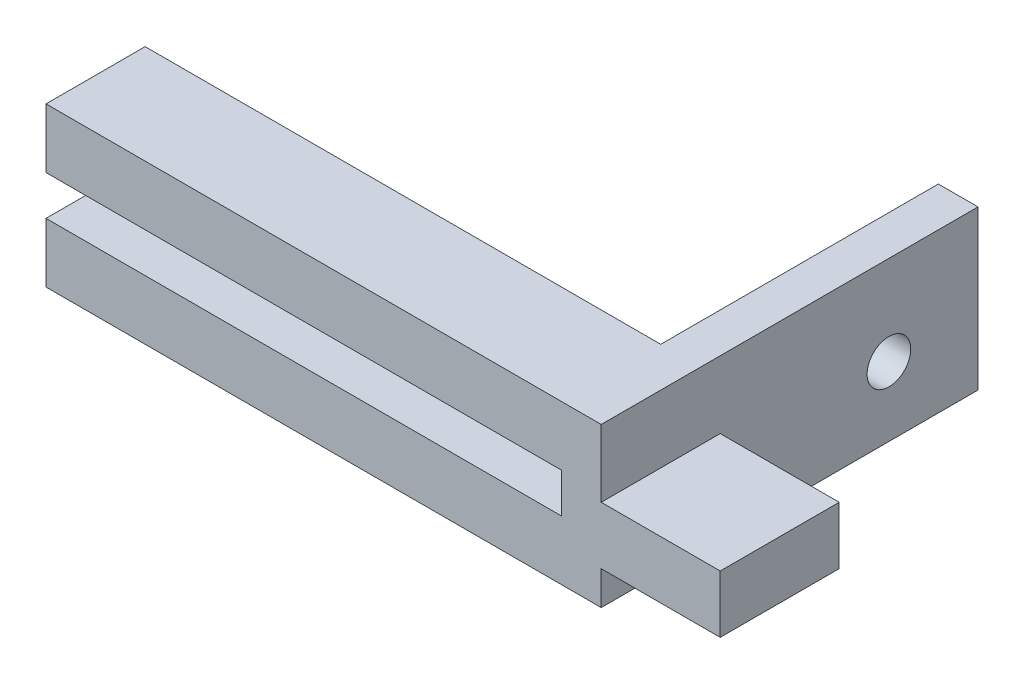
ISO-10303-21;
HEADER;
FILE_DESCRIPTION(('STEP AP214'),'2;1');
FILE_NAME('part.step','',(''),(''),'','','');
FILE_SCHEMA(('AUTOMOTIVE_DESIGN { 1 0 10303 214 1 1 1 1 }'));
ENDSEC;
DATA;
#1=APPLICATION_CONTEXT('core data for automotive mechanical design processes');
#2=APPLICATION_PROTOCOL_DEFINITION('international standard','automotive_design',2000,#1);
#3=PRODUCT_CONTEXT('',#1,'mechanical');
#4=PRODUCT('Part','Part','',(#3));
#5=PRODUCT_RELATED_PRODUCT_CATEGORY('part','',(#4));
#6=PRODUCT_DEFINITION_FORMATION('','',#4);
#7=PRODUCT_DEFINITION_CONTEXT('part definition',#1,'design');
#8=PRODUCT_DEFINITION('design','',#6,#7);
#9=PRODUCT_DEFINITION_SHAPE('','',#8);
#10=(LENGTH_UNIT() NAMED_UNIT(*) SI_UNIT(.MILLI.,.METRE.));
#11=(NAMED_UNIT(*) PLANE_ANGLE_UNIT() SI_UNIT($,.RADIAN.));
#12=(NAMED_UNIT(*) SI_UNIT($,.STERADIAN.) SOLID_ANGLE_UNIT());
#13=UNCERTAINTY_MEASURE_WITH_UNIT(LENGTH_MEASURE(1.E-05),#10,'distance_accuracy_value','');
#14=(GEOMETRIC_REPRESENTATION_CONTEXT(3) GLOBAL_UNCERTAINTY_ASSIGNED_CONTEXT((#13)) GLOBAL_UNIT_ASSIGNED_CONTEXT((#10,
#11,#12)) REPRESENTATION_CONTEXT('',''));
#15=CARTESIAN_POINT('',(0.,0.,0.));
#16=DIRECTION('',(0.,0.,1.));
#17=DIRECTION('',(1.,0.,0.));
#18=AXIS2_PLACEMENT_3D('',#15,#16,#17);
#19=CARTESIAN_POINT('',(10.,0.,0.));
#20=DIRECTION('',(1.,0.,0.));
#21=DIRECTION('',(0.,0.,-1.));
#22=AXIS2_PLACEMENT_3D('',#19,#20,#21);
#23=PLANE('',#22);
#24=CARTESIAN_POINT('',(10.,-2.43042682926831,-36.6253658536586));
#25=DIRECTION('',(1.,0.,0.));
#26=DIRECTION('',(0.,0.,-1.));
#27=AXIS2_PLACEMENT_3D('',#24,#25,#26);
#28=CIRCLE('',#27,5.5);
#29=CARTESIAN_POINT('',(10.,-2.43042682926831,-42.1253658536586));
#30=VERTEX_POINT('',#29);
#31=EDGE_CURVE('E49',#30,#30,#28,.T.);
#32=ORIENTED_EDGE('',*,*,#31,.F.);
#33=EDGE_LOOP('',(#32));
#34=FACE_BOUND('',#33,.T.);
#35=DIRECTION('',(0.,1.,0.));
#36=VECTOR('',#35,1.);
#37=CARTESIAN_POINT('',(10.,-2.8704268292683,5.91463414634144));
#38=LINE('',#37,#36);
#39=CARTESIAN_POINT('',(10.,-11.3704268292683,5.91463414634144));
#40=VERTEX_POINT('',#39);
#41=CARTESIAN_POINT('',(10.,3.1295731707317,5.91463414634144));
#42=VERTEX_POINT('',#41);
#43=EDGE_CURVE('E178',#40,#42,#38,.T.);
#44=ORIENTED_EDGE('',*,*,#43,.F.);
#45=DIRECTION('',(0.,0.,-1.));
#46=VECTOR('',#45,1.);
#47=CARTESIAN_POINT('',(10.,-11.3704268292683,35.9146341463414));
#48=LINE('',#47,#46);
#49=CARTESIAN_POINT('',(10.,-11.3704268292683,35.9146341463414));
#50=VERTEX_POINT('',#49);
#51=EDGE_CURVE('E166',#50,#40,#48,.T.);
#52=ORIENTED_EDGE('',*,*,#51,.F.);
#53=DIRECTION('',(0.,-1.,0.));
#54=VECTOR('',#53,1.);
#55=CARTESIAN_POINT('',(10.,20.1295731707317,35.9146341463414));
#56=LINE('',#55,#54);
#57=CARTESIAN_POINT('',(10.,-19.8704268292683,35.9146341463414));
#58=VERTEX_POINT('',#57);
#59=EDGE_CURVE('E161',#50,#58,#56,.T.);
#60=ORIENTED_EDGE('',*,*,#59,.T.);
#61=DIRECTION('',(0.,0.,-1.));
#62=VECTOR('',#61,1.);
#63=CARTESIAN_POINT('',(10.,-19.8704268292683,35.9146341463414));
#64=LINE('',#63,#62);
#65=CARTESIAN_POINT('',(10.,-19.8704268292683,-59.0853658536586));
#66=VERTEX_POINT('',#65);
#67=EDGE_CURVE('E270',#58,#66,#64,.T.);
#68=ORIENTED_EDGE('',*,*,#67,.T.);
#69=DIRECTION('',(0.,1.,0.));
#70=VECTOR('',#69,1.);
#71=CARTESIAN_POINT('',(10.,20.1295731707317,-59.0853658536586));
#72=LINE('',#71,#70);
#73=CARTESIAN_POINT('',(10.,20.1295731707317,-59.0853658536586));
#74=VERTEX_POINT('',#73);
#75=EDGE_CURVE('E273',#66,#74,#72,.T.);
#76=ORIENTED_EDGE('',*,*,#75,.T.);
#77=DIRECTION('',(0.,0.,1.));
#78=VECTOR('',#77,1.);
#79=CARTESIAN_POINT('',(10.,20.1295731707317,35.9146341463414));
#80=LINE('',#79,#78);
#81=CARTESIAN_POINT('',(10.,20.1295731707317,35.9146341463414));
#82=VERTEX_POINT('',#81);
#83=EDGE_CURVE('E276',#74,#82,#80,.T.);
#84=ORIENTED_EDGE('',*,*,#83,.T.);
#85=CARTESIAN_POINT('',(10.,3.12957317073169,35.9146341463414));
#86=VERTEX_POINT('',#85);
#87=EDGE_CURVE('E67',#82,#86,#56,.T.);
#88=ORIENTED_EDGE('',*,*,#87,.T.);
#89=DIRECTION('',(0.,0.,1.));
#90=VECTOR('',#89,1.);
#91=CARTESIAN_POINT('',(10.,3.1295731707317,5.91463414634144));
#92=LINE('',#91,#90);
#93=EDGE_CURVE('E62',#42,#86,#92,.T.);
#94=ORIENTED_EDGE('',*,*,#93,.F.);
#95=EDGE_LOOP('',(#44,#52,#60,#68,#76,#84,#88,#94));
#96=FACE_BOUND('',#95,.T.);
#97=ADVANCED_FACE('F45',(#34,#96),#23,.T.);
#98=CARTESIAN_POINT('',(0.,0.,0.));
#99=DIRECTION('',(1.,0.,0.));
#100=DIRECTION('',(0.,0.,-1.));
#101=AXIS2_PLACEMENT_3D('',#98,#99,#100);
#102=PLANE('',#101);
#103=CARTESIAN_POINT('',(0.,-2.43042682926831,-36.6253658536586));
#104=DIRECTION('',(-1.,0.,0.));
#105=DIRECTION('',(0.,0.,1.));
#106=AXIS2_PLACEMENT_3D('',#103,#104,#105);
#107=CIRCLE('',#106,5.5);
#108=CARTESIAN_POINT('',(0.,-2.43042682926831,-31.1253658536586));
#109=VERTEX_POINT('',#108);
#110=EDGE_CURVE('E195',#109,#109,#107,.T.);
#111=ORIENTED_EDGE('',*,*,#110,.F.);
#112=EDGE_LOOP('',(#111));
#113=FACE_BOUND('',#112,.T.);
#114=DIRECTION('',(0.,-1.,0.));
#115=VECTOR('',#114,1.);
#116=CARTESIAN_POINT('',(0.,20.1295731707317,10.9146341463414));
#117=LINE('',#116,#115);
#118=CARTESIAN_POINT('',(0.,20.1295731707317,10.9146341463414));
#119=VERTEX_POINT('',#118);
#120=CARTESIAN_POINT('',(0.,5.12957317073169,10.9146341463414));
#121=VERTEX_POINT('',#120);
#122=EDGE_CURVE('E215',#119,#121,#117,.T.);
#123=ORIENTED_EDGE('',*,*,#122,.F.);
#124=DIRECTION('',(0.,0.,1.));
#125=VECTOR('',#124,1.);
#126=CARTESIAN_POINT('',(0.,20.1295731707317,35.9146341463414));
#127=LINE('',#126,#125);
#128=CARTESIAN_POINT('',(0.,20.1295731707317,-59.0853658536586));
#129=VERTEX_POINT('',#128);
#130=EDGE_CURVE('E289',#129,#119,#127,.T.);
#131=ORIENTED_EDGE('',*,*,#130,.F.);
#132=DIRECTION('',(0.,1.,0.));
#133=VECTOR('',#132,1.);
#134=CARTESIAN_POINT('',(0.,20.1295731707317,-59.0853658536586));
#135=LINE('',#134,#133);
#136=CARTESIAN_POINT('',(0.,-19.8704268292683,-59.0853658536586));
#137=VERTEX_POINT('',#136);
#138=EDGE_CURVE('E286',#137,#129,#135,.T.);
#139=ORIENTED_EDGE('',*,*,#138,.F.);
#140=DIRECTION('',(0.,0.,-1.));
#141=VECTOR('',#140,1.);
#142=CARTESIAN_POINT('',(0.,-19.8704268292683,35.9146341463414));
#143=LINE('',#142,#141);
#144=CARTESIAN_POINT('',(0.,-19.8704268292683,10.9146341463414));
#145=VERTEX_POINT('',#144);
#146=EDGE_CURVE('E283',#145,#137,#143,.T.);
#147=ORIENTED_EDGE('',*,*,#146,.F.);
#148=DIRECTION('',(0.,-1.,0.));
#149=VECTOR('',#148,1.);
#150=CARTESIAN_POINT('',(0.,-4.87042682926831,10.9146341463414));
#151=LINE('',#150,#149);
#152=CARTESIAN_POINT('',(0.,-4.87042682926831,10.9146341463414));
#153=VERTEX_POINT('',#152);
#154=EDGE_CURVE('E248',#153,#145,#151,.T.);
#155=ORIENTED_EDGE('',*,*,#154,.F.);
#156=DIRECTION('',(0.,0.,-1.));
#157=VECTOR('',#156,1.);
#158=CARTESIAN_POINT('',(0.,-4.87042682926831,35.9146341463414));
#159=LINE('',#158,#157);
#160=CARTESIAN_POINT('',(0.,-4.87042682926831,35.9146341463414));
#161=VERTEX_POINT('',#160);
#162=EDGE_CURVE('E219',#161,#153,#159,.T.);
#163=ORIENTED_EDGE('',*,*,#162,.F.);
#164=DIRECTION('',(0.,-1.,0.));
#165=VECTOR('',#164,1.);
#166=CARTESIAN_POINT('',(0.,20.1295731707317,35.9146341463414));
#167=LINE('',#166,#165);
#168=CARTESIAN_POINT('',(0.,5.12957317073169,35.9146341463414));
#169=VERTEX_POINT('',#168);
#170=EDGE_CURVE('E234',#169,#161,#167,.T.);
#171=ORIENTED_EDGE('',*,*,#170,.F.);
#172=DIRECTION('',(0.,0.,1.));
#173=VECTOR('',#172,1.);
#174=CARTESIAN_POINT('',(0.,5.12957317073169,10.9146341463414));
#175=LINE('',#174,#173);
#176=EDGE_CURVE('E204',#121,#169,#175,.T.);
#177=ORIENTED_EDGE('',*,*,#176,.F.);
#178=EDGE_LOOP('',(#123,#131,#139,#147,#155,#163,#171,#177));
#179=FACE_BOUND('',#178,.T.);
#180=ADVANCED_FACE('F311',(#113,#179),#102,.F.);
#181=CARTESIAN_POINT('',(10.,20.1295731707317,35.9146341463414));
#182=DIRECTION('',(0.,0.,-1.));
#183=DIRECTION('',(0.,1.,0.));
#184=AXIS2_PLACEMENT_3D('',#181,#182,#183);
#185=PLANE('',#184);
#186=ORIENTED_EDGE('',*,*,#59,.F.);
#187=DIRECTION('',(-1.,0.,0.));
#188=VECTOR('',#187,1.);
#189=CARTESIAN_POINT('',(40.,-11.3704268292683,35.9146341463414));
#190=LINE('',#189,#188);
#191=CARTESIAN_POINT('',(40.,-11.3704268292683,35.9146341463414));
#192=VERTEX_POINT('',#191);
#193=EDGE_CURVE('E159',#192,#50,#190,.T.);
#194=ORIENTED_EDGE('',*,*,#193,.F.);
#195=DIRECTION('',(0.,-1.,0.));
#196=VECTOR('',#195,1.);
#197=CARTESIAN_POINT('',(40.,-2.87042682926831,35.9146341463414));
#198=LINE('',#197,#196);
#199=CARTESIAN_POINT('',(40.,3.12957317073169,35.9146341463414));
#200=VERTEX_POINT('',#199);
#201=EDGE_CURVE('E145',#200,#192,#198,.T.);
#202=ORIENTED_EDGE('',*,*,#201,.F.);
#203=DIRECTION('',(-1.,0.,0.));
#204=VECTOR('',#203,1.);
#205=CARTESIAN_POINT('',(40.,3.12957317073169,35.9146341463414));
#206=LINE('',#205,#204);
#207=EDGE_CURVE('E184',#200,#86,#206,.T.);
#208=ORIENTED_EDGE('',*,*,#207,.T.);
#209=ORIENTED_EDGE('',*,*,#87,.F.);
#210=DIRECTION('',(-1.,0.,0.));
#211=VECTOR('',#210,1.);
#212=CARTESIAN_POINT('',(10.,20.1295731707317,35.9146341463414));
#213=LINE('',#212,#211);
#214=CARTESIAN_POINT('',(-130.,20.1295731707317,35.9146341463414));
#215=VERTEX_POINT('',#214);
#216=EDGE_CURVE('E279',#82,#215,#213,.T.);
#217=ORIENTED_EDGE('',*,*,#216,.T.);
#218=DIRECTION('',(0.,1.,0.));
#219=VECTOR('',#218,1.);
#220=CARTESIAN_POINT('',(-130.,20.1295731707317,35.9146341463414));
#221=LINE('',#220,#219);
#222=CARTESIAN_POINT('',(-130.,5.12957317073169,35.9146341463414));
#223=VERTEX_POINT('',#222);
#224=EDGE_CURVE('E207',#223,#215,#221,.T.);
#225=ORIENTED_EDGE('',*,*,#224,.F.);
#226=DIRECTION('',(1.,0.,0.));
#227=VECTOR('',#226,1.);
#228=CARTESIAN_POINT('',(-130.,5.12957317073169,35.9146341463414));
#229=LINE('',#228,#227);
#230=EDGE_CURVE('E226',#223,#169,#229,.T.);
#231=ORIENTED_EDGE('',*,*,#230,.T.);
#232=ORIENTED_EDGE('',*,*,#170,.T.);
#233=DIRECTION('',(1.,0.,0.));
#234=VECTOR('',#233,1.);
#235=CARTESIAN_POINT('',(-130.,-4.87042682926831,35.9146341463414));
#236=LINE('',#235,#234);
#237=CARTESIAN_POINT('',(-130.,-4.87042682926831,35.9146341463414));
#238=VERTEX_POINT('',#237);
#239=EDGE_CURVE('E235',#238,#161,#236,.T.);
#240=ORIENTED_EDGE('',*,*,#239,.F.);
#241=DIRECTION('',(0.,1.,0.));
#242=VECTOR('',#241,1.);
#243=CARTESIAN_POINT('',(-130.,-4.87042682926831,35.9146341463414));
#244=LINE('',#243,#242);
#245=CARTESIAN_POINT('',(-130.,-19.8704268292683,35.9146341463414));
#246=VERTEX_POINT('',#245);
#247=EDGE_CURVE('E252',#246,#238,#244,.T.);
#248=ORIENTED_EDGE('',*,*,#247,.F.);
#249=DIRECTION('',(-1.,0.,0.));
#250=VECTOR('',#249,1.);
#251=CARTESIAN_POINT('',(10.,-19.8704268292683,35.9146341463414));
#252=LINE('',#251,#250);
#253=EDGE_CURVE('E11',#58,#246,#252,.T.);
#254=ORIENTED_EDGE('',*,*,#253,.F.);
#255=EDGE_LOOP('',(#186,#194,#202,#208,#209,#217,#225,#231,#232,#240,#248,#254));
#256=FACE_BOUND('',#255,.T.);
#257=ADVANCED_FACE('F47',(#256),#185,.F.);
#258=CARTESIAN_POINT('',(10.,-19.8704268292683,35.9146341463414));
#259=DIRECTION('',(0.,1.,0.));
#260=DIRECTION('',(0.,0.,1.));
#261=AXIS2_PLACEMENT_3D('',#258,#259,#260);
#262=PLANE('',#261);
#263=ORIENTED_EDGE('',*,*,#253,.T.);
#264=DIRECTION('',(0.,0.,1.));
#265=VECTOR('',#264,1.);
#266=CARTESIAN_POINT('',(-130.,-19.8704268292683,35.9146341463414));
#267=LINE('',#266,#265);
#268=CARTESIAN_POINT('',(-130.,-19.8704268292683,10.9146341463414));
#269=VERTEX_POINT('',#268);
#270=EDGE_CURVE('E247',#269,#246,#267,.T.);
#271=ORIENTED_EDGE('',*,*,#270,.F.);
#272=DIRECTION('',(1.,0.,0.));
#273=VECTOR('',#272,1.);
#274=CARTESIAN_POINT('',(-130.,-19.8704268292683,10.9146341463414));
#275=LINE('',#274,#273);
#276=EDGE_CURVE('E243',#269,#145,#275,.T.);
#277=ORIENTED_EDGE('',*,*,#276,.T.);
#278=ORIENTED_EDGE('',*,*,#146,.T.);
#279=DIRECTION('',(-1.,0.,0.));
#280=VECTOR('',#279,1.);
#281=CARTESIAN_POINT('',(10.,-19.8704268292683,-59.0853658536586));
#282=LINE('',#281,#280);
#283=EDGE_CURVE('E55',#66,#137,#282,.T.);
#284=ORIENTED_EDGE('',*,*,#283,.F.);
#285=ORIENTED_EDGE('',*,*,#67,.F.);
#286=EDGE_LOOP('',(#263,#271,#277,#278,#284,#285));
#287=FACE_BOUND('',#286,.T.);
#288=ADVANCED_FACE('F332',(#287),#262,.F.);
#289=CARTESIAN_POINT('',(10.,20.1295731707317,-59.0853658536586));
#290=DIRECTION('',(0.,0.,1.));
#291=DIRECTION('',(1.,0.,0.));
#292=AXIS2_PLACEMENT_3D('',#289,#290,#291);
#293=PLANE('',#292);
#294=ORIENTED_EDGE('',*,*,#138,.T.);
#295=DIRECTION('',(-1.,0.,0.));
#296=VECTOR('',#295,1.);
#297=CARTESIAN_POINT('',(10.,20.1295731707317,-59.0853658536586));
#298=LINE('',#297,#296);
#299=EDGE_CURVE('E295',#74,#129,#298,.T.);
#300=ORIENTED_EDGE('',*,*,#299,.F.);
#301=ORIENTED_EDGE('',*,*,#75,.F.);
#302=ORIENTED_EDGE('',*,*,#283,.T.);
#303=EDGE_LOOP('',(#294,#300,#301,#302));
#304=FACE_BOUND('',#303,.T.);
#305=ADVANCED_FACE('F305',(#304),#293,.F.);
#306=CARTESIAN_POINT('',(10.,20.1295731707317,35.9146341463414));
#307=DIRECTION('',(0.,-1.,0.));
#308=DIRECTION('',(0.,0.,-1.));
#309=AXIS2_PLACEMENT_3D('',#306,#307,#308);
#310=PLANE('',#309);
#311=ORIENTED_EDGE('',*,*,#130,.T.);
#312=DIRECTION('',(1.,0.,0.));
#313=VECTOR('',#312,1.);
#314=CARTESIAN_POINT('',(-130.,20.1295731707317,10.9146341463414));
#315=LINE('',#314,#313);
#316=CARTESIAN_POINT('',(-130.,20.1295731707317,10.9146341463414));
#317=VERTEX_POINT('',#316);
#318=EDGE_CURVE('E214',#317,#119,#315,.T.);
#319=ORIENTED_EDGE('',*,*,#318,.F.);
#320=DIRECTION('',(0.,0.,-1.));
#321=VECTOR('',#320,1.);
#322=CARTESIAN_POINT('',(-130.,20.1295731707317,10.9146341463414));
#323=LINE('',#322,#321);
#324=EDGE_CURVE('E211',#215,#317,#323,.T.);
#325=ORIENTED_EDGE('',*,*,#324,.F.);
#326=ORIENTED_EDGE('',*,*,#216,.F.);
#327=ORIENTED_EDGE('',*,*,#83,.F.);
#328=ORIENTED_EDGE('',*,*,#299,.T.);
#329=EDGE_LOOP('',(#311,#319,#325,#326,#327,#328));
#330=FACE_BOUND('',#329,.T.);
#331=ADVANCED_FACE('F314',(#330),#310,.F.);
#332=CARTESIAN_POINT('',(-130.,-4.87042682926831,35.9146341463414));
#333=DIRECTION('',(0.,-1.,0.));
#334=DIRECTION('',(0.,0.,-1.));
#335=AXIS2_PLACEMENT_3D('',#332,#333,#334);
#336=PLANE('',#335);
#337=ORIENTED_EDGE('',*,*,#162,.T.);
#338=DIRECTION('',(1.,0.,0.));
#339=VECTOR('',#338,1.);
#340=CARTESIAN_POINT('',(-130.,-4.87042682926831,10.9146341463414));
#341=LINE('',#340,#339);
#342=CARTESIAN_POINT('',(-130.,-4.87042682926831,10.9146341463414));
#343=VERTEX_POINT('',#342);
#344=EDGE_CURVE('E239',#343,#153,#341,.T.);
#345=ORIENTED_EDGE('',*,*,#344,.F.);
#346=DIRECTION('',(0.,0.,-1.));
#347=VECTOR('',#346,1.);
#348=CARTESIAN_POINT('',(-130.,-4.87042682926831,35.9146341463414));
#349=LINE('',#348,#347);
#350=EDGE_CURVE('E262',#238,#343,#349,.T.);
#351=ORIENTED_EDGE('',*,*,#350,.F.);
#352=ORIENTED_EDGE('',*,*,#239,.T.);
#353=EDGE_LOOP('',(#337,#345,#351,#352));
#354=FACE_BOUND('',#353,.T.);
#355=ADVANCED_FACE('F344',(#354),#336,.F.);
#356=CARTESIAN_POINT('',(-130.,-4.87042682926831,10.9146341463414));
#357=DIRECTION('',(0.,0.,1.));
#358=DIRECTION('',(0.,-1.,0.));
#359=AXIS2_PLACEMENT_3D('',#356,#357,#358);
#360=PLANE('',#359);
#361=ORIENTED_EDGE('',*,*,#154,.T.);
#362=ORIENTED_EDGE('',*,*,#276,.F.);
#363=DIRECTION('',(0.,-1.,0.));
#364=VECTOR('',#363,1.);
#365=CARTESIAN_POINT('',(-130.,-4.87042682926831,10.9146341463414));
#366=LINE('',#365,#364);
#367=EDGE_CURVE('E259',#343,#269,#366,.T.);
#368=ORIENTED_EDGE('',*,*,#367,.F.);
#369=ORIENTED_EDGE('',*,*,#344,.T.);
#370=EDGE_LOOP('',(#361,#362,#368,#369));
#371=FACE_BOUND('',#370,.T.);
#372=ADVANCED_FACE('F342',(#371),#360,.F.);
#373=CARTESIAN_POINT('',(-130.,0.,0.));
#374=DIRECTION('',(1.,0.,0.));
#375=DIRECTION('',(0.,0.,-1.));
#376=AXIS2_PLACEMENT_3D('',#373,#374,#375);
#377=PLANE('',#376);
#378=ORIENTED_EDGE('',*,*,#247,.T.);
#379=ORIENTED_EDGE('',*,*,#350,.T.);
#380=ORIENTED_EDGE('',*,*,#367,.T.);
#381=ORIENTED_EDGE('',*,*,#270,.T.);
#382=EDGE_LOOP('',(#378,#379,#380,#381));
#383=FACE_BOUND('',#382,.T.);
#384=ADVANCED_FACE('F337',(#383),#377,.F.);
#385=CARTESIAN_POINT('',(-130.,20.1295731707317,10.9146341463414));
#386=DIRECTION('',(0.,0.,1.));
#387=DIRECTION('',(1.,0.,0.));
#388=AXIS2_PLACEMENT_3D('',#385,#386,#387);
#389=PLANE('',#388);
#390=ORIENTED_EDGE('',*,*,#122,.T.);
#391=DIRECTION('',(1.,0.,0.));
#392=VECTOR('',#391,1.);
#393=CARTESIAN_POINT('',(-130.,5.12957317073169,10.9146341463414));
#394=LINE('',#393,#392);
#395=CARTESIAN_POINT('',(-130.,5.12957317073169,10.9146341463414));
#396=VERTEX_POINT('',#395);
#397=EDGE_CURVE('E230',#396,#121,#394,.T.);
#398=ORIENTED_EDGE('',*,*,#397,.F.);
#399=DIRECTION('',(0.,-1.,0.));
#400=VECTOR('',#399,1.);
#401=CARTESIAN_POINT('',(-130.,20.1295731707317,10.9146341463414));
#402=LINE('',#401,#400);
#403=EDGE_CURVE('E199',#317,#396,#402,.T.);
#404=ORIENTED_EDGE('',*,*,#403,.F.);
#405=ORIENTED_EDGE('',*,*,#318,.T.);
#406=EDGE_LOOP('',(#390,#398,#404,#405));
#407=FACE_BOUND('',#406,.T.);
#408=ADVANCED_FACE('F319',(#407),#389,.F.);
#409=CARTESIAN_POINT('',(-130.,5.12957317073169,10.9146341463414));
#410=DIRECTION('',(0.,1.,0.));
#411=DIRECTION('',(0.,0.,1.));
#412=AXIS2_PLACEMENT_3D('',#409,#410,#411);
#413=PLANE('',#412);
#414=ORIENTED_EDGE('',*,*,#176,.T.);
#415=ORIENTED_EDGE('',*,*,#230,.F.);
#416=DIRECTION('',(0.,0.,1.));
#417=VECTOR('',#416,1.);
#418=CARTESIAN_POINT('',(-130.,5.12957317073169,10.9146341463414));
#419=LINE('',#418,#417);
#420=EDGE_CURVE('E203',#396,#223,#419,.T.);
#421=ORIENTED_EDGE('',*,*,#420,.F.);
#422=ORIENTED_EDGE('',*,*,#397,.T.);
#423=EDGE_LOOP('',(#414,#415,#421,#422));
#424=FACE_BOUND('',#423,.T.);
#425=ADVANCED_FACE('F430',(#424),#413,.F.);
#426=CARTESIAN_POINT('',(-130.,0.,0.));
#427=DIRECTION('',(-1.,0.,0.));
#428=DIRECTION('',(0.,0.,1.));
#429=AXIS2_PLACEMENT_3D('',#426,#427,#428);
#430=PLANE('',#429);
#431=ORIENTED_EDGE('',*,*,#403,.T.);
#432=ORIENTED_EDGE('',*,*,#420,.T.);
#433=ORIENTED_EDGE('',*,*,#224,.T.);
#434=ORIENTED_EDGE('',*,*,#324,.T.);
#435=EDGE_LOOP('',(#431,#432,#433,#434));
#436=FACE_BOUND('',#435,.T.);
#437=ADVANCED_FACE('F322',(#436),#430,.T.);
#438=CARTESIAN_POINT('',(27.,-2.43042682926831,-36.6253658536586));
#439=DIRECTION('',(-1.,0.,0.));
#440=DIRECTION('',(0.,0.,1.));
#441=AXIS2_PLACEMENT_3D('',#438,#439,#440);
#442=CYLINDRICAL_SURFACE('',#441,5.5);
#443=ORIENTED_EDGE('',*,*,#31,.T.);
#444=EDGE_LOOP('',(#443));
#445=FACE_BOUND('',#444,.T.);
#446=ORIENTED_EDGE('',*,*,#110,.T.);
#447=EDGE_LOOP('',(#446));
#448=FACE_BOUND('',#447,.T.);
#449=ADVANCED_FACE('F381',(#445,#448),#442,.F.);
#450=CARTESIAN_POINT('',(40.,-2.8704268292683,5.91463414634144));
#451=DIRECTION('',(0.,0.,1.));
#452=DIRECTION('',(1.,0.,0.));
#453=AXIS2_PLACEMENT_3D('',#450,#451,#452);
#454=PLANE('',#453);
#455=ORIENTED_EDGE('',*,*,#43,.T.);
#456=DIRECTION('',(-1.,0.,0.));
#457=VECTOR('',#456,1.);
#458=CARTESIAN_POINT('',(40.,3.1295731707317,5.91463414634144));
#459=LINE('',#458,#457);
#460=CARTESIAN_POINT('',(40.,3.1295731707317,5.91463414634144));
#461=VERTEX_POINT('',#460);
#462=EDGE_CURVE('E191',#461,#42,#459,.T.);
#463=ORIENTED_EDGE('',*,*,#462,.F.);
#464=DIRECTION('',(0.,1.,0.));
#465=VECTOR('',#464,1.);
#466=CARTESIAN_POINT('',(40.,-2.8704268292683,5.91463414634144));
#467=LINE('',#466,#465);
#468=CARTESIAN_POINT('',(40.,-11.3704268292683,5.91463414634144));
#469=VERTEX_POINT('',#468);
#470=EDGE_CURVE('E156',#469,#461,#467,.T.);
#471=ORIENTED_EDGE('',*,*,#470,.F.);
#472=DIRECTION('',(1.,0.,0.));
#473=VECTOR('',#472,1.);
#474=CARTESIAN_POINT('',(40.,-11.3704268292683,5.91463414634144));
#475=LINE('',#474,#473);
#476=EDGE_CURVE('E171',#40,#469,#475,.T.);
#477=ORIENTED_EDGE('',*,*,#476,.F.);
#478=EDGE_LOOP('',(#455,#463,#471,#477));
#479=FACE_BOUND('',#478,.T.);
#480=ADVANCED_FACE('F330',(#479),#454,.F.);
#481=CARTESIAN_POINT('',(40.,3.1295731707317,5.91463414634144));
#482=DIRECTION('',(0.,-1.,0.));
#483=DIRECTION('',(0.,0.,-1.));
#484=AXIS2_PLACEMENT_3D('',#481,#482,#483);
#485=PLANE('',#484);
#486=ORIENTED_EDGE('',*,*,#93,.T.);
#487=ORIENTED_EDGE('',*,*,#207,.F.);
#488=DIRECTION('',(0.,0.,1.));
#489=VECTOR('',#488,1.);
#490=CARTESIAN_POINT('',(40.,3.1295731707317,5.91463414634144));
#491=LINE('',#490,#489);
#492=EDGE_CURVE('E151',#461,#200,#491,.T.);
#493=ORIENTED_EDGE('',*,*,#492,.F.);
#494=ORIENTED_EDGE('',*,*,#462,.T.);
#495=EDGE_LOOP('',(#486,#487,#493,#494));
#496=FACE_BOUND('',#495,.T.);
#497=ADVANCED_FACE('F327',(#496),#485,.F.);
#498=CARTESIAN_POINT('',(40.,0.,0.));
#499=DIRECTION('',(1.,0.,0.));
#500=DIRECTION('',(0.,0.,-1.));
#501=AXIS2_PLACEMENT_3D('',#498,#499,#500);
#502=PLANE('',#501);
#503=ORIENTED_EDGE('',*,*,#201,.T.);
#504=DIRECTION('',(0.,0.,1.));
#505=VECTOR('',#504,1.);
#506=CARTESIAN_POINT('',(40.,-11.3704268292683,35.9146341463414));
#507=LINE('',#506,#505);
#508=EDGE_CURVE('E149',#469,#192,#507,.T.);
#509=ORIENTED_EDGE('',*,*,#508,.F.);
#510=ORIENTED_EDGE('',*,*,#470,.T.);
#511=ORIENTED_EDGE('',*,*,#492,.T.);
#512=EDGE_LOOP('',(#503,#509,#510,#511));
#513=FACE_BOUND('',#512,.T.);
#514=ADVANCED_FACE('F147',(#513),#502,.T.);
#515=CARTESIAN_POINT('',(0.,-11.3704268292683,0.));
#516=DIRECTION('',(0.,1.,0.));
#517=DIRECTION('',(0.,0.,1.));
#518=AXIS2_PLACEMENT_3D('',#515,#516,#517);
#519=PLANE('',#518);
#520=ORIENTED_EDGE('',*,*,#508,.T.);
#521=ORIENTED_EDGE('',*,*,#193,.T.);
#522=ORIENTED_EDGE('',*,*,#51,.T.);
#523=ORIENTED_EDGE('',*,*,#476,.T.);
#524=EDGE_LOOP('',(#520,#521,#522,#523));
#525=FACE_BOUND('',#524,.T.);
#526=ADVANCED_FACE('F169',(#525),#519,.F.);
#527=CLOSED_SHELL('',(#97,#180,#257,#288,#305,#331,#355,#372,#384,#408,#425,#437,#449,#480,#497,
#514,#526));
#528=MANIFOLD_SOLID_BREP('B2',#527);
#529=ADVANCED_BREP_SHAPE_REPRESENTATION('',(#18,#528),#14);
#530=SHAPE_DEFINITION_REPRESENTATION(#9,#529);
ENDSEC;
END-ISO-10303-21;
